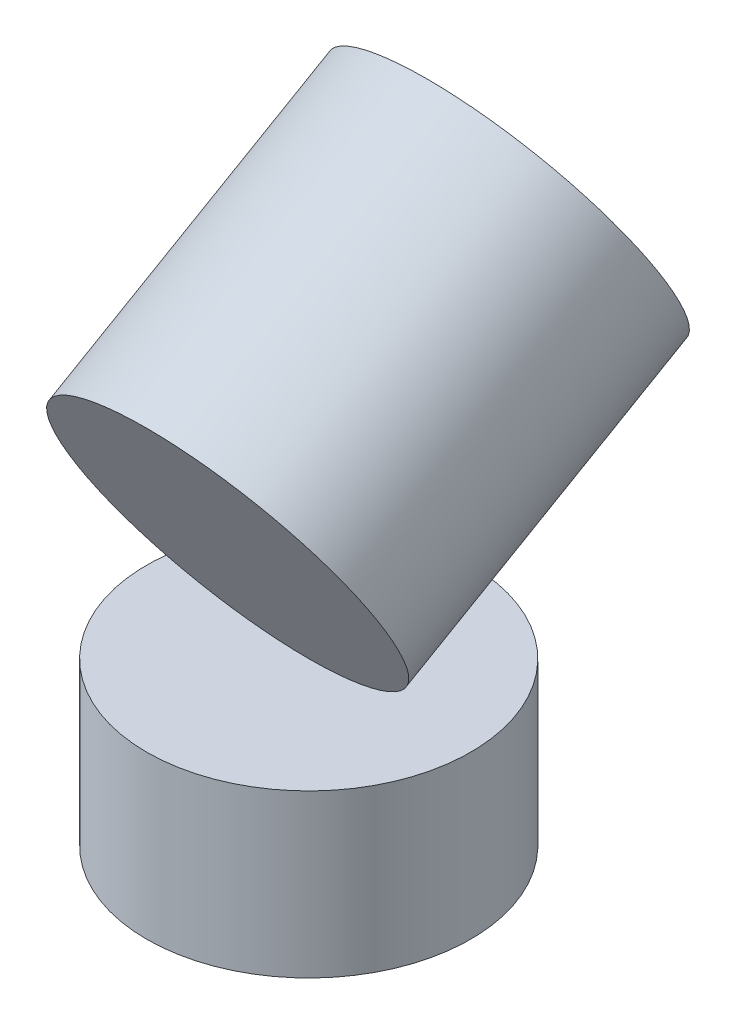
ISO-10303-21;
HEADER;
FILE_DESCRIPTION(('STEP AP214'),'2;1');
FILE_NAME('part.step','',(''),(''),'','','');
FILE_SCHEMA(('AUTOMOTIVE_DESIGN { 1 0 10303 214 1 1 1 1 }'));
ENDSEC;
DATA;
#1=APPLICATION_CONTEXT('core data for automotive mechanical design processes');
#2=APPLICATION_PROTOCOL_DEFINITION('international standard','automotive_design',2000,#1);
#3=PRODUCT_CONTEXT('',#1,'mechanical');
#4=PRODUCT('Part','Part','',(#3));
#5=PRODUCT_RELATED_PRODUCT_CATEGORY('part','',(#4));
#6=PRODUCT_DEFINITION_FORMATION('','',#4);
#7=PRODUCT_DEFINITION_CONTEXT('part definition',#1,'design');
#8=PRODUCT_DEFINITION('design','',#6,#7);
#9=PRODUCT_DEFINITION_SHAPE('','',#8);
#10=(LENGTH_UNIT() NAMED_UNIT(*) SI_UNIT(.MILLI.,.METRE.));
#11=(NAMED_UNIT(*) PLANE_ANGLE_UNIT() SI_UNIT($,.RADIAN.));
#12=(NAMED_UNIT(*) SI_UNIT($,.STERADIAN.) SOLID_ANGLE_UNIT());
#13=UNCERTAINTY_MEASURE_WITH_UNIT(LENGTH_MEASURE(1.E-05),#10,'distance_accuracy_value','');
#14=(GEOMETRIC_REPRESENTATION_CONTEXT(3) GLOBAL_UNCERTAINTY_ASSIGNED_CONTEXT((#13)) GLOBAL_UNIT_ASSIGNED_CONTEXT((#10,
#11,#12)) REPRESENTATION_CONTEXT('',''));
#15=CARTESIAN_POINT('',(0.,0.,0.));
#16=DIRECTION('',(0.,0.,1.));
#17=DIRECTION('',(1.,0.,0.));
#18=AXIS2_PLACEMENT_3D('',#15,#16,#17);
#19=CARTESIAN_POINT('',(0.,18.6602540378444,-12.3205080756888));
#20=DIRECTION('',(0.,-0.500000000000001,0.866025403784438));
#21=DIRECTION('',(0.,-0.866025403784438,-0.500000000000001));
#22=AXIS2_PLACEMENT_3D('',#19,#20,#21);
#23=CYLINDRICAL_SURFACE('',#22,10.);
#24=CARTESIAN_POINT('',(0.,18.6602540378444,-12.3205080756888));
#25=DIRECTION('',(0.,-0.500000000000001,0.866025403784438));
#26=DIRECTION('',(0.,-0.866025403784438,-0.500000000000001));
#27=AXIS2_PLACEMENT_3D('',#24,#25,#26);
#28=CIRCLE('',#27,10.);
#29=CARTESIAN_POINT('',(0.,10.,-17.3205080756888));
#30=VERTEX_POINT('',#29);
#31=EDGE_CURVE('E11',#30,#30,#28,.T.);
#32=ORIENTED_EDGE('',*,*,#31,.T.);
#33=EDGE_LOOP('',(#32));
#34=FACE_BOUND('',#33,.T.);
#35=CARTESIAN_POINT('',(0.,8.66025403784438,5.00000000000001));
#36=DIRECTION('',(0.,-0.500000000000001,0.866025403784438));
#37=DIRECTION('',(0.,-0.866025403784438,-0.500000000000001));
#38=AXIS2_PLACEMENT_3D('',#35,#36,#37);
#39=CIRCLE('',#38,10.);
#40=CARTESIAN_POINT('',(0.,0.,0.));
#41=VERTEX_POINT('',#40);
#42=EDGE_CURVE('E45',#41,#41,#39,.T.);
#43=ORIENTED_EDGE('',*,*,#42,.F.);
#44=EDGE_LOOP('',(#43));
#45=FACE_BOUND('',#44,.T.);
#46=ADVANCED_FACE('F42',(#34,#45),#23,.T.);
#47=CARTESIAN_POINT('',(0.,18.6602540378444,-12.3205080756888));
#48=DIRECTION('',(0.,-0.500000000000001,0.866025403784438));
#49=DIRECTION('',(0.,-0.866025403784438,-0.500000000000001));
#50=AXIS2_PLACEMENT_3D('',#47,#48,#49);
#51=PLANE('',#50);
#52=CARTESIAN_POINT('',(0.,18.6602540378444,-12.3205080756888));
#53=DIRECTION('',(0.,0.500000000000001,-0.866025403784438));
#54=DIRECTION('',(0.,0.866025403784438,0.500000000000001));
#55=AXIS2_PLACEMENT_3D('',#52,#53,#54);
#56=CIRCLE('',#55,7.5);
#57=CARTESIAN_POINT('',(0.,25.1554445662277,-8.57050807568875));
#58=VERTEX_POINT('',#57);
#59=EDGE_CURVE('E54',#58,#58,#56,.T.);
#60=ORIENTED_EDGE('',*,*,#59,.F.);
#61=EDGE_LOOP('',(#60));
#62=FACE_BOUND('',#61,.T.);
#63=ORIENTED_EDGE('',*,*,#31,.F.);
#64=EDGE_LOOP('',(#63));
#65=FACE_BOUND('',#64,.T.);
#66=ADVANCED_FACE('F69',(#62,#65),#51,.F.);
#67=CARTESIAN_POINT('',(0.,8.66025403784438,5.00000000000001));
#68=DIRECTION('',(0.,-0.500000000000001,0.866025403784438));
#69=DIRECTION('',(0.,-0.866025403784438,-0.500000000000001));
#70=AXIS2_PLACEMENT_3D('',#67,#68,#69);
#71=PLANE('',#70);
#72=ORIENTED_EDGE('',*,*,#42,.T.);
#73=EDGE_LOOP('',(#72));
#74=FACE_BOUND('',#73,.T.);
#75=ADVANCED_FACE('F65',(#74),#71,.T.);
#76=CARTESIAN_POINT('',(0.,13.6602540378444,-3.66025403784437));
#77=DIRECTION('',(0.,0.500000000000001,-0.866025403784438));
#78=DIRECTION('',(0.,0.866025403784438,0.500000000000001));
#79=AXIS2_PLACEMENT_3D('',#76,#77,#78);
#80=CYLINDRICAL_SURFACE('',#79,7.5);
#81=CARTESIAN_POINT('',(0.,13.6602540378444,-3.66025403784437));
#82=DIRECTION('',(0.,0.500000000000001,-0.866025403784438));
#83=DIRECTION('',(0.,0.866025403784438,0.500000000000001));
#84=AXIS2_PLACEMENT_3D('',#81,#82,#83);
#85=CIRCLE('',#84,7.5);
#86=CARTESIAN_POINT('',(0.,20.1554445662277,0.0897459621556338));
#87=VERTEX_POINT('',#86);
#88=EDGE_CURVE('E52',#87,#87,#85,.T.);
#89=ORIENTED_EDGE('',*,*,#88,.F.);
#90=EDGE_LOOP('',(#89));
#91=FACE_BOUND('',#90,.T.);
#92=ORIENTED_EDGE('',*,*,#59,.T.);
#93=EDGE_LOOP('',(#92));
#94=FACE_BOUND('',#93,.T.);
#95=ADVANCED_FACE('F62',(#91,#94),#80,.F.);
#96=CARTESIAN_POINT('',(0.,13.6602540378444,-3.66025403784437));
#97=DIRECTION('',(0.,0.500000000000001,-0.866025403784438));
#98=DIRECTION('',(0.,0.866025403784438,0.500000000000001));
#99=AXIS2_PLACEMENT_3D('',#96,#97,#98);
#100=PLANE('',#99);
#101=ORIENTED_EDGE('',*,*,#88,.T.);
#102=EDGE_LOOP('',(#101));
#103=FACE_BOUND('',#102,.T.);
#104=ADVANCED_FACE('F60',(#103),#100,.T.);
#105=CLOSED_SHELL('',(#46,#66,#75,#95,#104));
#106=MANIFOLD_SOLID_BREP('B2',#105);
#107=CARTESIAN_POINT('',(0.,-10.,0.));
#108=DIRECTION('',(0.,1.,0.));
#109=DIRECTION('',(0.,0.,1.));
#110=AXIS2_PLACEMENT_3D('',#107,#108,#109);
#111=CYLINDRICAL_SURFACE('',#110,10.);
#112=CARTESIAN_POINT('',(0.,-10.,0.));
#113=DIRECTION('',(0.,1.,0.));
#114=DIRECTION('',(0.,0.,1.));
#115=AXIS2_PLACEMENT_3D('',#112,#113,#114);
#116=CIRCLE('',#115,10.);
#117=CARTESIAN_POINT('',(0.,-10.,10.));
#118=VERTEX_POINT('',#117);
#119=EDGE_CURVE('E41',#118,#118,#116,.T.);
#120=ORIENTED_EDGE('',*,*,#119,.T.);
#121=EDGE_LOOP('',(#120));
#122=FACE_BOUND('',#121,.T.);
#123=CARTESIAN_POINT('',(0.,0.,0.));
#124=DIRECTION('',(0.,1.,0.));
#125=DIRECTION('',(0.,0.,1.));
#126=AXIS2_PLACEMENT_3D('',#123,#124,#125);
#127=CIRCLE('',#126,10.);
#128=CARTESIAN_POINT('',(0.,0.,10.));
#129=VERTEX_POINT('',#128);
#130=EDGE_CURVE('E115',#129,#129,#127,.T.);
#131=ORIENTED_EDGE('',*,*,#130,.F.);
#132=EDGE_LOOP('',(#131));
#133=FACE_BOUND('',#132,.T.);
#134=ADVANCED_FACE('F112',(#122,#133),#111,.T.);
#135=CARTESIAN_POINT('',(0.,-10.,0.));
#136=DIRECTION('',(0.,1.,0.));
#137=DIRECTION('',(0.,0.,1.));
#138=AXIS2_PLACEMENT_3D('',#135,#136,#137);
#139=PLANE('',#138);
#140=CARTESIAN_POINT('',(0.,-10.,0.));
#141=DIRECTION('',(0.,-1.,0.));
#142=DIRECTION('',(0.,0.,-1.));
#143=AXIS2_PLACEMENT_3D('',#140,#141,#142);
#144=CIRCLE('',#143,7.5);
#145=CARTESIAN_POINT('',(0.,-10.,-7.5));
#146=VERTEX_POINT('',#145);
#147=EDGE_CURVE('E124',#146,#146,#144,.T.);
#148=ORIENTED_EDGE('',*,*,#147,.F.);
#149=EDGE_LOOP('',(#148));
#150=FACE_BOUND('',#149,.T.);
#151=ORIENTED_EDGE('',*,*,#119,.F.);
#152=EDGE_LOOP('',(#151));
#153=FACE_BOUND('',#152,.T.);
#154=ADVANCED_FACE('F139',(#150,#153),#139,.F.);
#155=CARTESIAN_POINT('',(0.,0.,0.));
#156=DIRECTION('',(0.,1.,0.));
#157=DIRECTION('',(0.,0.,1.));
#158=AXIS2_PLACEMENT_3D('',#155,#156,#157);
#159=PLANE('',#158);
#160=ORIENTED_EDGE('',*,*,#130,.T.);
#161=EDGE_LOOP('',(#160));
#162=FACE_BOUND('',#161,.T.);
#163=ADVANCED_FACE('F135',(#162),#159,.T.);
#164=CARTESIAN_POINT('',(0.,-5.,0.));
#165=DIRECTION('',(0.,-1.,0.));
#166=DIRECTION('',(0.,0.,-1.));
#167=AXIS2_PLACEMENT_3D('',#164,#165,#166);
#168=CYLINDRICAL_SURFACE('',#167,7.5);
#169=CARTESIAN_POINT('',(0.,-5.,0.));
#170=DIRECTION('',(0.,-1.,0.));
#171=DIRECTION('',(0.,0.,-1.));
#172=AXIS2_PLACEMENT_3D('',#169,#170,#171);
#173=CIRCLE('',#172,7.5);
#174=CARTESIAN_POINT('',(0.,-5.,-7.5));
#175=VERTEX_POINT('',#174);
#176=EDGE_CURVE('E122',#175,#175,#173,.T.);
#177=ORIENTED_EDGE('',*,*,#176,.F.);
#178=EDGE_LOOP('',(#177));
#179=FACE_BOUND('',#178,.T.);
#180=ORIENTED_EDGE('',*,*,#147,.T.);
#181=EDGE_LOOP('',(#180));
#182=FACE_BOUND('',#181,.T.);
#183=ADVANCED_FACE('F132',(#179,#182),#168,.F.);
#184=CARTESIAN_POINT('',(0.,-5.,0.));
#185=DIRECTION('',(0.,-1.,0.));
#186=DIRECTION('',(0.,0.,-1.));
#187=AXIS2_PLACEMENT_3D('',#184,#185,#186);
#188=PLANE('',#187);
#189=ORIENTED_EDGE('',*,*,#176,.T.);
#190=EDGE_LOOP('',(#189));
#191=FACE_BOUND('',#190,.T.);
#192=ADVANCED_FACE('F130',(#191),#188,.T.);
#193=CLOSED_SHELL('',(#134,#154,#163,#183,#192));
#194=MANIFOLD_SOLID_BREP('B6',#193);
#195=ADVANCED_BREP_SHAPE_REPRESENTATION('',(#18,#106,#194),#14);
#196=SHAPE_DEFINITION_REPRESENTATION(#9,#195);
ENDSEC;
END-ISO-10303-21;
